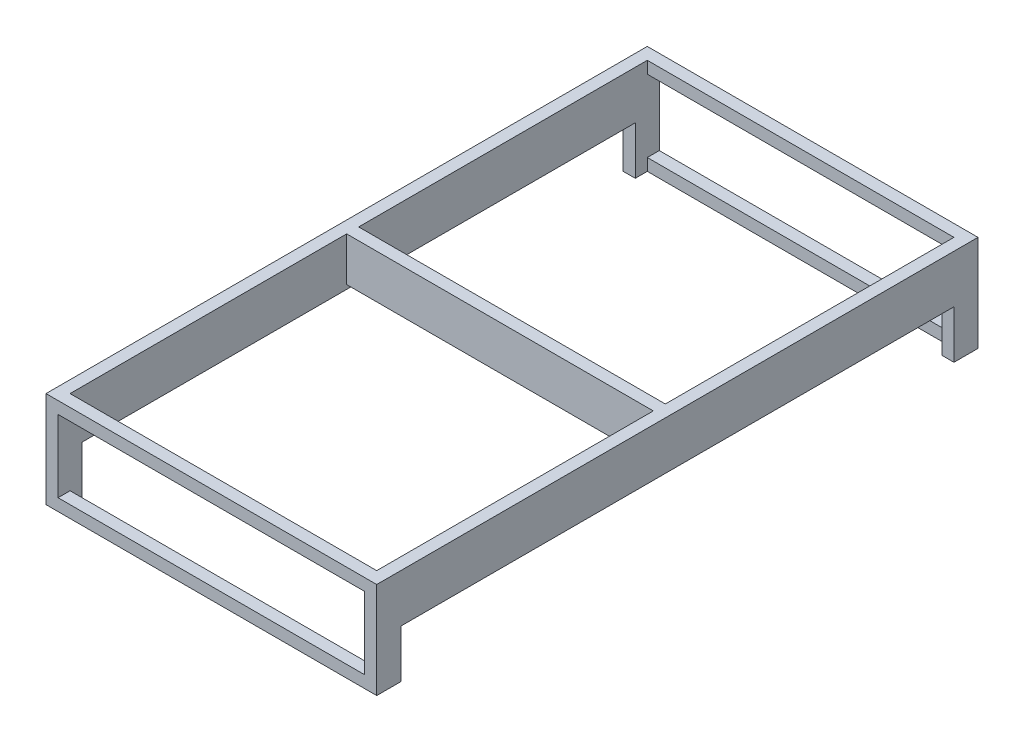
ISO-10303-21;
HEADER;
FILE_DESCRIPTION(('STEP AP214'),'2;1');
FILE_NAME('part.step','',(''),(''),'','','');
FILE_SCHEMA(('AUTOMOTIVE_DESIGN { 1 0 10303 214 1 1 1 1 }'));
ENDSEC;
DATA;
#1=APPLICATION_CONTEXT('core data for automotive mechanical design processes');
#2=APPLICATION_PROTOCOL_DEFINITION('international standard','automotive_design',2000,#1);
#3=PRODUCT_CONTEXT('',#1,'mechanical');
#4=PRODUCT('Part','Part','',(#3));
#5=PRODUCT_RELATED_PRODUCT_CATEGORY('part','',(#4));
#6=PRODUCT_DEFINITION_FORMATION('','',#4);
#7=PRODUCT_DEFINITION_CONTEXT('part definition',#1,'design');
#8=PRODUCT_DEFINITION('design','',#6,#7);
#9=PRODUCT_DEFINITION_SHAPE('','',#8);
#10=(LENGTH_UNIT() NAMED_UNIT(*) SI_UNIT(.MILLI.,.METRE.));
#11=(NAMED_UNIT(*) PLANE_ANGLE_UNIT() SI_UNIT($,.RADIAN.));
#12=(NAMED_UNIT(*) SI_UNIT($,.STERADIAN.) SOLID_ANGLE_UNIT());
#13=UNCERTAINTY_MEASURE_WITH_UNIT(LENGTH_MEASURE(1.E-05),#10,'distance_accuracy_value','');
#14=(GEOMETRIC_REPRESENTATION_CONTEXT(3) GLOBAL_UNCERTAINTY_ASSIGNED_CONTEXT((#13)) GLOBAL_UNIT_ASSIGNED_CONTEXT((#10,
#11,#12)) REPRESENTATION_CONTEXT('',''));
#15=CARTESIAN_POINT('',(0.,0.,0.));
#16=DIRECTION('',(0.,0.,1.));
#17=DIRECTION('',(1.,0.,0.));
#18=AXIS2_PLACEMENT_3D('',#15,#16,#17);
#19=CARTESIAN_POINT('',(0.,120.,1000.));
#20=DIRECTION('',(0.,-1.,0.));
#21=DIRECTION('',(0.,0.,-1.));
#22=AXIS2_PLACEMENT_3D('',#19,#20,#21);
#23=PLANE('',#22);
#24=DIRECTION('',(-1.,0.,0.));
#25=VECTOR('',#24,1.);
#26=CARTESIAN_POINT('',(0.,120.,980.));
#27=LINE('',#26,#25);
#28=CARTESIAN_POINT('',(510.,120.,980.));
#29=VERTEX_POINT('',#28);
#30=CARTESIAN_POINT('',(0.,120.,980.));
#31=VERTEX_POINT('',#30);
#32=EDGE_CURVE('E411',#29,#31,#27,.T.);
#33=ORIENTED_EDGE('',*,*,#32,.F.);
#34=DIRECTION('',(0.,0.,-1.));
#35=VECTOR('',#34,1.);
#36=CARTESIAN_POINT('',(510.,120.,1000.));
#37=LINE('',#36,#35);
#38=CARTESIAN_POINT('',(510.,120.,1000.));
#39=VERTEX_POINT('',#38);
#40=EDGE_CURVE('E358',#39,#29,#37,.T.);
#41=ORIENTED_EDGE('',*,*,#40,.F.);
#42=DIRECTION('',(-1.,0.,0.));
#43=VECTOR('',#42,1.);
#44=CARTESIAN_POINT('',(0.,120.,1000.));
#45=LINE('',#44,#43);
#46=CARTESIAN_POINT('',(0.,120.,1000.));
#47=VERTEX_POINT('',#46);
#48=EDGE_CURVE('E341',#39,#47,#45,.T.);
#49=ORIENTED_EDGE('',*,*,#48,.T.);
#50=DIRECTION('',(0.,0.,-1.));
#51=VECTOR('',#50,1.);
#52=CARTESIAN_POINT('',(0.,120.,1000.));
#53=LINE('',#52,#51);
#54=EDGE_CURVE('E354',#47,#31,#53,.T.);
#55=ORIENTED_EDGE('',*,*,#54,.T.);
#56=EDGE_LOOP('',(#33,#41,#49,#55));
#57=FACE_BOUND('',#56,.T.);
#58=ADVANCED_FACE('F37',(#57),#23,.T.);
#59=CARTESIAN_POINT('',(980.,60.,40.));
#60=DIRECTION('',(0.,0.,-1.));
#61=DIRECTION('',(0.,1.,0.));
#62=AXIS2_PLACEMENT_3D('',#59,#60,#61);
#63=PLANE('',#62);
#64=DIRECTION('',(-1.,0.,0.));
#65=VECTOR('',#64,1.);
#66=CARTESIAN_POINT('',(980.,-20.,40.));
#67=LINE('',#66,#65);
#68=CARTESIAN_POINT('',(0.,-20.,40.));
#69=VERTEX_POINT('',#68);
#70=CARTESIAN_POINT('',(-20.,-20.,40.));
#71=VERTEX_POINT('',#70);
#72=EDGE_CURVE('E303',#69,#71,#67,.T.);
#73=ORIENTED_EDGE('',*,*,#72,.F.);
#74=DIRECTION('',(0.,1.,0.));
#75=VECTOR('',#74,1.);
#76=CARTESIAN_POINT('',(0.,0.,40.));
#77=LINE('',#76,#75);
#78=CARTESIAN_POINT('',(0.,60.,40.));
#79=VERTEX_POINT('',#78);
#80=EDGE_CURVE('E327',#69,#79,#77,.T.);
#81=ORIENTED_EDGE('',*,*,#80,.T.);
#82=DIRECTION('',(-1.,0.,0.));
#83=VECTOR('',#82,1.);
#84=CARTESIAN_POINT('',(980.,60.,40.));
#85=LINE('',#84,#83);
#86=CARTESIAN_POINT('',(-20.,60.,40.));
#87=VERTEX_POINT('',#86);
#88=EDGE_CURVE('E304',#79,#87,#85,.T.);
#89=ORIENTED_EDGE('',*,*,#88,.T.);
#90=DIRECTION('',(0.,-1.,0.));
#91=VECTOR('',#90,1.);
#92=CARTESIAN_POINT('',(-20.,60.,40.));
#93=LINE('',#92,#91);
#94=EDGE_CURVE('E294',#87,#71,#93,.T.);
#95=ORIENTED_EDGE('',*,*,#94,.T.);
#96=EDGE_LOOP('',(#73,#81,#89,#95));
#97=FACE_BOUND('',#96,.T.);
#98=ADVANCED_FACE('F456',(#97),#63,.F.);
#99=CARTESIAN_POINT('',(980.,60.,960.));
#100=DIRECTION('',(0.,0.,1.));
#101=DIRECTION('',(1.,0.,0.));
#102=AXIS2_PLACEMENT_3D('',#99,#100,#101);
#103=PLANE('',#102);
#104=DIRECTION('',(0.,-1.,0.));
#105=VECTOR('',#104,1.);
#106=CARTESIAN_POINT('',(0.,0.,960.));
#107=LINE('',#106,#105);
#108=CARTESIAN_POINT('',(0.,60.,960.));
#109=VERTEX_POINT('',#108);
#110=CARTESIAN_POINT('',(0.,-20.,960.));
#111=VERTEX_POINT('',#110);
#112=EDGE_CURVE('E317',#109,#111,#107,.T.);
#113=ORIENTED_EDGE('',*,*,#112,.T.);
#114=DIRECTION('',(-1.,0.,0.));
#115=VECTOR('',#114,1.);
#116=CARTESIAN_POINT('',(980.,-20.,960.));
#117=LINE('',#116,#115);
#118=CARTESIAN_POINT('',(-20.,-20.,960.));
#119=VERTEX_POINT('',#118);
#120=EDGE_CURVE('E313',#111,#119,#117,.T.);
#121=ORIENTED_EDGE('',*,*,#120,.T.);
#122=DIRECTION('',(0.,1.,0.));
#123=VECTOR('',#122,1.);
#124=CARTESIAN_POINT('',(-20.,60.,960.));
#125=LINE('',#124,#123);
#126=CARTESIAN_POINT('',(-20.,60.,960.));
#127=VERTEX_POINT('',#126);
#128=EDGE_CURVE('E297',#119,#127,#125,.T.);
#129=ORIENTED_EDGE('',*,*,#128,.T.);
#130=DIRECTION('',(-1.,0.,0.));
#131=VECTOR('',#130,1.);
#132=CARTESIAN_POINT('',(980.,60.,960.));
#133=LINE('',#132,#131);
#134=EDGE_CURVE('E308',#109,#127,#133,.T.);
#135=ORIENTED_EDGE('',*,*,#134,.F.);
#136=EDGE_LOOP('',(#113,#121,#129,#135));
#137=FACE_BOUND('',#136,.T.);
#138=ADVANCED_FACE('F502',(#137),#103,.F.);
#139=CARTESIAN_POINT('',(-20.,-20.,1000.));
#140=DIRECTION('',(0.,1.,0.));
#141=DIRECTION('',(0.,0.,1.));
#142=AXIS2_PLACEMENT_3D('',#139,#140,#141);
#143=PLANE('',#142);
#144=DIRECTION('',(-1.,0.,0.));
#145=VECTOR('',#144,1.);
#146=CARTESIAN_POINT('',(-20.,-20.,20.));
#147=LINE('',#146,#145);
#148=CARTESIAN_POINT('',(510.,-20.,20.));
#149=VERTEX_POINT('',#148);
#150=CARTESIAN_POINT('',(0.,-20.,20.));
#151=VERTEX_POINT('',#150);
#152=EDGE_CURVE('E286',#149,#151,#147,.T.);
#153=ORIENTED_EDGE('',*,*,#152,.T.);
#154=DIRECTION('',(0.,0.,1.));
#155=VECTOR('',#154,1.);
#156=CARTESIAN_POINT('',(0.,-20.,1000.));
#157=LINE('',#156,#155);
#158=EDGE_CURVE('E281',#151,#69,#157,.T.);
#159=ORIENTED_EDGE('',*,*,#158,.T.);
#160=ORIENTED_EDGE('',*,*,#72,.T.);
#161=DIRECTION('',(0.,0.,-1.));
#162=VECTOR('',#161,1.);
#163=CARTESIAN_POINT('',(-20.,-20.,1000.));
#164=LINE('',#163,#162);
#165=CARTESIAN_POINT('',(-20.,-20.,0.));
#166=VERTEX_POINT('',#165);
#167=EDGE_CURVE('E380',#71,#166,#164,.T.);
#168=ORIENTED_EDGE('',*,*,#167,.T.);
#169=DIRECTION('',(1.,0.,0.));
#170=VECTOR('',#169,1.);
#171=CARTESIAN_POINT('',(-20.,-20.,0.));
#172=LINE('',#171,#170);
#173=CARTESIAN_POINT('',(530.,-20.,0.));
#174=VERTEX_POINT('',#173);
#175=EDGE_CURVE('E369',#166,#174,#172,.T.);
#176=ORIENTED_EDGE('',*,*,#175,.T.);
#177=DIRECTION('',(0.,0.,-1.));
#178=VECTOR('',#177,1.);
#179=CARTESIAN_POINT('',(530.,-20.,1000.));
#180=LINE('',#179,#178);
#181=CARTESIAN_POINT('',(530.,-20.,40.));
#182=VERTEX_POINT('',#181);
#183=EDGE_CURVE('E398',#182,#174,#180,.T.);
#184=ORIENTED_EDGE('',*,*,#183,.F.);
#185=CARTESIAN_POINT('',(510.,-20.,40.));
#186=VERTEX_POINT('',#185);
#187=EDGE_CURVE('E314',#182,#186,#67,.T.);
#188=ORIENTED_EDGE('',*,*,#187,.T.);
#189=DIRECTION('',(0.,0.,-1.));
#190=VECTOR('',#189,1.);
#191=CARTESIAN_POINT('',(510.,-20.,1000.));
#192=LINE('',#191,#190);
#193=EDGE_CURVE('E275',#186,#149,#192,.T.);
#194=ORIENTED_EDGE('',*,*,#193,.T.);
#195=EDGE_LOOP('',(#153,#159,#160,#168,#176,#184,#188,#194));
#196=FACE_BOUND('',#195,.T.);
#197=ADVANCED_FACE('F454',(#196),#143,.F.);
#198=CARTESIAN_POINT('',(0.,0.,1000.));
#199=DIRECTION('',(0.,1.,0.));
#200=DIRECTION('',(0.,0.,1.));
#201=AXIS2_PLACEMENT_3D('',#198,#199,#200);
#202=PLANE('',#201);
#203=DIRECTION('',(-1.,0.,0.));
#204=VECTOR('',#203,1.);
#205=CARTESIAN_POINT('',(0.,0.,20.));
#206=LINE('',#205,#204);
#207=CARTESIAN_POINT('',(510.,0.,20.));
#208=VERTEX_POINT('',#207);
#209=CARTESIAN_POINT('',(0.,0.,20.));
#210=VERTEX_POINT('',#209);
#211=EDGE_CURVE('E284',#208,#210,#206,.T.);
#212=ORIENTED_EDGE('',*,*,#211,.F.);
#213=DIRECTION('',(0.,0.,-1.));
#214=VECTOR('',#213,1.);
#215=CARTESIAN_POINT('',(510.,0.,1000.));
#216=LINE('',#215,#214);
#217=CARTESIAN_POINT('',(510.,0.,0.));
#218=VERTEX_POINT('',#217);
#219=EDGE_CURVE('E361',#208,#218,#216,.T.);
#220=ORIENTED_EDGE('',*,*,#219,.T.);
#221=DIRECTION('',(1.,0.,0.));
#222=VECTOR('',#221,1.);
#223=CARTESIAN_POINT('',(0.,0.,0.));
#224=LINE('',#223,#222);
#225=CARTESIAN_POINT('',(0.,0.,0.));
#226=VERTEX_POINT('',#225);
#227=EDGE_CURVE('E346',#226,#218,#224,.T.);
#228=ORIENTED_EDGE('',*,*,#227,.F.);
#229=DIRECTION('',(0.,0.,-1.));
#230=VECTOR('',#229,1.);
#231=CARTESIAN_POINT('',(0.,0.,1000.));
#232=LINE('',#231,#230);
#233=EDGE_CURVE('E365',#210,#226,#232,.T.);
#234=ORIENTED_EDGE('',*,*,#233,.F.);
#235=EDGE_LOOP('',(#212,#220,#228,#234));
#236=FACE_BOUND('',#235,.T.);
#237=ADVANCED_FACE('F446',(#236),#202,.T.);
#238=CARTESIAN_POINT('',(0.,0.,1000.));
#239=DIRECTION('',(0.,0.,1.));
#240=DIRECTION('',(1.,0.,0.));
#241=AXIS2_PLACEMENT_3D('',#238,#239,#240);
#242=PLANE('',#241);
#243=DIRECTION('',(1.,0.,0.));
#244=VECTOR('',#243,1.);
#245=CARTESIAN_POINT('',(-20.,-20.,1000.));
#246=LINE('',#245,#244);
#247=CARTESIAN_POINT('',(-20.,-20.,1000.));
#248=VERTEX_POINT('',#247);
#249=CARTESIAN_POINT('',(530.,-20.,1000.));
#250=VERTEX_POINT('',#249);
#251=EDGE_CURVE('E370',#248,#250,#246,.T.);
#252=ORIENTED_EDGE('',*,*,#251,.T.);
#253=DIRECTION('',(0.,1.,0.));
#254=VECTOR('',#253,1.);
#255=CARTESIAN_POINT('',(530.,-20.,1000.));
#256=LINE('',#255,#254);
#257=CARTESIAN_POINT('',(530.,140.,1000.));
#258=VERTEX_POINT('',#257);
#259=EDGE_CURVE('E373',#250,#258,#256,.T.);
#260=ORIENTED_EDGE('',*,*,#259,.T.);
#261=DIRECTION('',(-1.,0.,0.));
#262=VECTOR('',#261,1.);
#263=CARTESIAN_POINT('',(-20.,140.,1000.));
#264=LINE('',#263,#262);
#265=CARTESIAN_POINT('',(-20.,140.,1000.));
#266=VERTEX_POINT('',#265);
#267=EDGE_CURVE('E376',#258,#266,#264,.T.);
#268=ORIENTED_EDGE('',*,*,#267,.T.);
#269=DIRECTION('',(0.,-1.,0.));
#270=VECTOR('',#269,1.);
#271=CARTESIAN_POINT('',(-20.,-20.,1000.));
#272=LINE('',#271,#270);
#273=EDGE_CURVE('E378',#266,#248,#272,.T.);
#274=ORIENTED_EDGE('',*,*,#273,.T.);
#275=EDGE_LOOP('',(#252,#260,#268,#274));
#276=FACE_BOUND('',#275,.T.);
#277=DIRECTION('',(1.,0.,0.));
#278=VECTOR('',#277,1.);
#279=CARTESIAN_POINT('',(0.,0.,1000.));
#280=LINE('',#279,#278);
#281=CARTESIAN_POINT('',(0.,0.,1000.));
#282=VERTEX_POINT('',#281);
#283=CARTESIAN_POINT('',(510.,0.,1000.));
#284=VERTEX_POINT('',#283);
#285=EDGE_CURVE('E335',#282,#284,#280,.T.);
#286=ORIENTED_EDGE('',*,*,#285,.F.);
#287=DIRECTION('',(0.,-1.,0.));
#288=VECTOR('',#287,1.);
#289=CARTESIAN_POINT('',(0.,0.,1000.));
#290=LINE('',#289,#288);
#291=EDGE_CURVE('E333',#47,#282,#290,.T.);
#292=ORIENTED_EDGE('',*,*,#291,.F.);
#293=ORIENTED_EDGE('',*,*,#48,.F.);
#294=DIRECTION('',(0.,1.,0.));
#295=VECTOR('',#294,1.);
#296=CARTESIAN_POINT('',(510.,0.,1000.));
#297=LINE('',#296,#295);
#298=EDGE_CURVE('E338',#284,#39,#297,.T.);
#299=ORIENTED_EDGE('',*,*,#298,.F.);
#300=EDGE_LOOP('',(#286,#292,#293,#299));
#301=FACE_BOUND('',#300,.T.);
#302=ADVANCED_FACE('F495',(#276,#301),#242,.T.);
#303=CARTESIAN_POINT('',(0.,0.,0.));
#304=DIRECTION('',(0.,0.,1.));
#305=DIRECTION('',(1.,0.,0.));
#306=AXIS2_PLACEMENT_3D('',#303,#304,#305);
#307=PLANE('',#306);
#308=ORIENTED_EDGE('',*,*,#175,.F.);
#309=DIRECTION('',(0.,-1.,0.));
#310=VECTOR('',#309,1.);
#311=CARTESIAN_POINT('',(-20.,-20.,0.));
#312=LINE('',#311,#310);
#313=CARTESIAN_POINT('',(-20.,140.,0.));
#314=VERTEX_POINT('',#313);
#315=EDGE_CURVE('E374',#314,#166,#312,.T.);
#316=ORIENTED_EDGE('',*,*,#315,.F.);
#317=DIRECTION('',(-1.,0.,0.));
#318=VECTOR('',#317,1.);
#319=CARTESIAN_POINT('',(-20.,140.,0.));
#320=LINE('',#319,#318);
#321=CARTESIAN_POINT('',(530.,140.,0.));
#322=VERTEX_POINT('',#321);
#323=EDGE_CURVE('E386',#322,#314,#320,.T.);
#324=ORIENTED_EDGE('',*,*,#323,.F.);
#325=DIRECTION('',(0.,1.,0.));
#326=VECTOR('',#325,1.);
#327=CARTESIAN_POINT('',(530.,-20.,0.));
#328=LINE('',#327,#326);
#329=EDGE_CURVE('E383',#174,#322,#328,.T.);
#330=ORIENTED_EDGE('',*,*,#329,.F.);
#331=EDGE_LOOP('',(#308,#316,#324,#330));
#332=FACE_BOUND('',#331,.T.);
#333=DIRECTION('',(0.,-1.,0.));
#334=VECTOR('',#333,1.);
#335=CARTESIAN_POINT('',(0.,0.,0.));
#336=LINE('',#335,#334);
#337=CARTESIAN_POINT('',(0.,120.,0.));
#338=VERTEX_POINT('',#337);
#339=EDGE_CURVE('E332',#338,#226,#336,.T.);
#340=ORIENTED_EDGE('',*,*,#339,.T.);
#341=ORIENTED_EDGE('',*,*,#227,.T.);
#342=DIRECTION('',(0.,1.,0.));
#343=VECTOR('',#342,1.);
#344=CARTESIAN_POINT('',(510.,0.,0.));
#345=LINE('',#344,#343);
#346=CARTESIAN_POINT('',(510.,120.,0.));
#347=VERTEX_POINT('',#346);
#348=EDGE_CURVE('E349',#218,#347,#345,.T.);
#349=ORIENTED_EDGE('',*,*,#348,.T.);
#350=DIRECTION('',(-1.,0.,0.));
#351=VECTOR('',#350,1.);
#352=CARTESIAN_POINT('',(0.,120.,0.));
#353=LINE('',#352,#351);
#354=EDGE_CURVE('E336',#347,#338,#353,.T.);
#355=ORIENTED_EDGE('',*,*,#354,.T.);
#356=EDGE_LOOP('',(#340,#341,#349,#355));
#357=FACE_BOUND('',#356,.T.);
#358=ADVANCED_FACE('F442',(#332,#357),#307,.F.);
#359=ORIENTED_EDGE('',*,*,#120,.F.);
#360=DIRECTION('',(0.,0.,1.));
#361=VECTOR('',#360,1.);
#362=CARTESIAN_POINT('',(0.,-20.,1000.));
#363=LINE('',#362,#361);
#364=CARTESIAN_POINT('',(0.,-20.,980.));
#365=VERTEX_POINT('',#364);
#366=EDGE_CURVE('E278',#111,#365,#363,.T.);
#367=ORIENTED_EDGE('',*,*,#366,.T.);
#368=DIRECTION('',(1.,0.,0.));
#369=VECTOR('',#368,1.);
#370=CARTESIAN_POINT('',(-20.,-20.,980.));
#371=LINE('',#370,#369);
#372=CARTESIAN_POINT('',(510.,-20.,980.));
#373=VERTEX_POINT('',#372);
#374=EDGE_CURVE('E291',#365,#373,#371,.T.);
#375=ORIENTED_EDGE('',*,*,#374,.T.);
#376=DIRECTION('',(0.,0.,-1.));
#377=VECTOR('',#376,1.);
#378=CARTESIAN_POINT('',(510.,-20.,1000.));
#379=LINE('',#378,#377);
#380=CARTESIAN_POINT('',(510.,-20.,960.));
#381=VERTEX_POINT('',#380);
#382=EDGE_CURVE('E272',#373,#381,#379,.T.);
#383=ORIENTED_EDGE('',*,*,#382,.T.);
#384=CARTESIAN_POINT('',(530.,-20.,960.));
#385=VERTEX_POINT('',#384);
#386=EDGE_CURVE('E310',#385,#381,#117,.T.);
#387=ORIENTED_EDGE('',*,*,#386,.F.);
#388=EDGE_CURVE('E399',#250,#385,#180,.T.);
#389=ORIENTED_EDGE('',*,*,#388,.F.);
#390=ORIENTED_EDGE('',*,*,#251,.F.);
#391=EDGE_CURVE('E391',#248,#119,#164,.T.);
#392=ORIENTED_EDGE('',*,*,#391,.T.);
#393=EDGE_LOOP('',(#359,#367,#375,#383,#387,#389,#390,#392));
#394=FACE_BOUND('',#393,.T.);
#395=ADVANCED_FACE('F39',(#394),#143,.F.);
#396=CARTESIAN_POINT('',(530.,-20.,1000.));
#397=DIRECTION('',(-1.,0.,0.));
#398=DIRECTION('',(0.,0.,1.));
#399=AXIS2_PLACEMENT_3D('',#396,#397,#398);
#400=PLANE('',#399);
#401=ORIENTED_EDGE('',*,*,#329,.T.);
#402=DIRECTION('',(0.,0.,-1.));
#403=VECTOR('',#402,1.);
#404=CARTESIAN_POINT('',(530.,140.,1000.));
#405=LINE('',#404,#403);
#406=EDGE_CURVE('E396',#258,#322,#405,.T.);
#407=ORIENTED_EDGE('',*,*,#406,.F.);
#408=ORIENTED_EDGE('',*,*,#259,.F.);
#409=ORIENTED_EDGE('',*,*,#388,.T.);
#410=DIRECTION('',(0.,1.,0.));
#411=VECTOR('',#410,1.);
#412=CARTESIAN_POINT('',(530.,-20.,960.));
#413=LINE('',#412,#411);
#414=CARTESIAN_POINT('',(530.,60.,960.));
#415=VERTEX_POINT('',#414);
#416=EDGE_CURVE('E319',#385,#415,#413,.T.);
#417=ORIENTED_EDGE('',*,*,#416,.T.);
#418=DIRECTION('',(0.,0.,-1.));
#419=VECTOR('',#418,1.);
#420=CARTESIAN_POINT('',(530.,60.,1000.));
#421=LINE('',#420,#419);
#422=CARTESIAN_POINT('',(530.,60.,40.));
#423=VERTEX_POINT('',#422);
#424=EDGE_CURVE('E324',#415,#423,#421,.T.);
#425=ORIENTED_EDGE('',*,*,#424,.T.);
#426=DIRECTION('',(0.,-1.,0.));
#427=VECTOR('',#426,1.);
#428=CARTESIAN_POINT('',(530.,-20.0000000000001,40.));
#429=LINE('',#428,#427);
#430=EDGE_CURVE('E329',#423,#182,#429,.T.);
#431=ORIENTED_EDGE('',*,*,#430,.T.);
#432=ORIENTED_EDGE('',*,*,#183,.T.);
#433=EDGE_LOOP('',(#401,#407,#408,#409,#417,#425,#431,#432));
#434=FACE_BOUND('',#433,.T.);
#435=ADVANCED_FACE('F471',(#434),#400,.F.);
#436=CARTESIAN_POINT('',(-20.,140.,1000.));
#437=DIRECTION('',(0.,-1.,0.));
#438=DIRECTION('',(0.,0.,-1.));
#439=AXIS2_PLACEMENT_3D('',#436,#437,#438);
#440=PLANE('',#439);
#441=DIRECTION('',(-1.,0.,0.));
#442=VECTOR('',#441,1.);
#443=CARTESIAN_POINT('',(-20.,140.,500.));
#444=LINE('',#443,#442);
#445=CARTESIAN_POINT('',(510.,140.,500.));
#446=VERTEX_POINT('',#445);
#447=CARTESIAN_POINT('',(0.,140.,500.));
#448=VERTEX_POINT('',#447);
#449=EDGE_CURVE('E241',#446,#448,#444,.T.);
#450=ORIENTED_EDGE('',*,*,#449,.T.);
#451=DIRECTION('',(0.,0.,1.));
#452=VECTOR('',#451,1.);
#453=CARTESIAN_POINT('',(0.,140.,0.));
#454=LINE('',#453,#452);
#455=CARTESIAN_POINT('',(0.,140.,20.));
#456=VERTEX_POINT('',#455);
#457=EDGE_CURVE('E230',#456,#448,#454,.T.);
#458=ORIENTED_EDGE('',*,*,#457,.F.);
#459=DIRECTION('',(-1.,0.,0.));
#460=VECTOR('',#459,1.);
#461=CARTESIAN_POINT('',(0.,140.,20.));
#462=LINE('',#461,#460);
#463=CARTESIAN_POINT('',(510.,140.,20.));
#464=VERTEX_POINT('',#463);
#465=EDGE_CURVE('E231',#464,#456,#462,.T.);
#466=ORIENTED_EDGE('',*,*,#465,.F.);
#467=DIRECTION('',(0.,0.,-1.));
#468=VECTOR('',#467,1.);
#469=CARTESIAN_POINT('',(510.,140.,0.));
#470=LINE('',#469,#468);
#471=EDGE_CURVE('E253',#446,#464,#470,.T.);
#472=ORIENTED_EDGE('',*,*,#471,.F.);
#473=EDGE_LOOP('',(#450,#458,#466,#472));
#474=FACE_BOUND('',#473,.T.);
#475=DIRECTION('',(1.,0.,0.));
#476=VECTOR('',#475,1.);
#477=CARTESIAN_POINT('',(-20.,140.,520.));
#478=LINE('',#477,#476);
#479=CARTESIAN_POINT('',(0.,140.,520.));
#480=VERTEX_POINT('',#479);
#481=CARTESIAN_POINT('',(510.,140.,520.));
#482=VERTEX_POINT('',#481);
#483=EDGE_CURVE('E226',#480,#482,#478,.T.);
#484=ORIENTED_EDGE('',*,*,#483,.T.);
#485=CARTESIAN_POINT('',(510.,140.,980.));
#486=VERTEX_POINT('',#485);
#487=EDGE_CURVE('E254',#486,#482,#470,.T.);
#488=ORIENTED_EDGE('',*,*,#487,.F.);
#489=DIRECTION('',(1.,0.,0.));
#490=VECTOR('',#489,1.);
#491=CARTESIAN_POINT('',(0.,140.,980.));
#492=LINE('',#491,#490);
#493=CARTESIAN_POINT('',(0.,140.,980.));
#494=VERTEX_POINT('',#493);
#495=EDGE_CURVE('E227',#494,#486,#492,.T.);
#496=ORIENTED_EDGE('',*,*,#495,.F.);
#497=EDGE_CURVE('E221',#480,#494,#454,.T.);
#498=ORIENTED_EDGE('',*,*,#497,.F.);
#499=EDGE_LOOP('',(#484,#488,#496,#498));
#500=FACE_BOUND('',#499,.T.);
#501=ORIENTED_EDGE('',*,*,#406,.T.);
#502=ORIENTED_EDGE('',*,*,#323,.T.);
#503=DIRECTION('',(0.,0.,-1.));
#504=VECTOR('',#503,1.);
#505=CARTESIAN_POINT('',(-20.,140.,1000.));
#506=LINE('',#505,#504);
#507=EDGE_CURVE('E394',#266,#314,#506,.T.);
#508=ORIENTED_EDGE('',*,*,#507,.F.);
#509=ORIENTED_EDGE('',*,*,#267,.F.);
#510=EDGE_LOOP('',(#501,#502,#508,#509));
#511=FACE_BOUND('',#510,.T.);
#512=ADVANCED_FACE('F222',(#474,#500,#511),#440,.F.);
#513=CARTESIAN_POINT('',(-20.,-20.,1000.));
#514=DIRECTION('',(1.,0.,0.));
#515=DIRECTION('',(0.,0.,-1.));
#516=AXIS2_PLACEMENT_3D('',#513,#514,#515);
#517=PLANE('',#516);
#518=ORIENTED_EDGE('',*,*,#507,.T.);
#519=ORIENTED_EDGE('',*,*,#315,.T.);
#520=ORIENTED_EDGE('',*,*,#167,.F.);
#521=ORIENTED_EDGE('',*,*,#94,.F.);
#522=DIRECTION('',(0.,0.,-1.));
#523=VECTOR('',#522,1.);
#524=CARTESIAN_POINT('',(-20.,60.,40.));
#525=LINE('',#524,#523);
#526=EDGE_CURVE('E300',#127,#87,#525,.T.);
#527=ORIENTED_EDGE('',*,*,#526,.F.);
#528=ORIENTED_EDGE('',*,*,#128,.F.);
#529=ORIENTED_EDGE('',*,*,#391,.F.);
#530=ORIENTED_EDGE('',*,*,#273,.F.);
#531=EDGE_LOOP('',(#518,#519,#520,#521,#527,#528,#529,#530));
#532=FACE_BOUND('',#531,.T.);
#533=ADVANCED_FACE('F462',(#532),#517,.F.);
#534=CARTESIAN_POINT('',(0.,0.,1000.));
#535=DIRECTION('',(1.,0.,0.));
#536=DIRECTION('',(0.,0.,-1.));
#537=AXIS2_PLACEMENT_3D('',#534,#535,#536);
#538=PLANE('',#537);
#539=DIRECTION('',(0.,1.,0.));
#540=VECTOR('',#539,1.);
#541=CARTESIAN_POINT('',(0.,0.,500.));
#542=LINE('',#541,#540);
#543=CARTESIAN_POINT('',(0.,67.,500.));
#544=VERTEX_POINT('',#543);
#545=EDGE_CURVE('E52',#544,#448,#542,.T.);
#546=ORIENTED_EDGE('',*,*,#545,.F.);
#547=DIRECTION('',(0.,0.,-1.));
#548=VECTOR('',#547,1.);
#549=CARTESIAN_POINT('',(0.,67.,1000.));
#550=LINE('',#549,#548);
#551=CARTESIAN_POINT('',(0.,67.,520.));
#552=VERTEX_POINT('',#551);
#553=EDGE_CURVE('E56',#552,#544,#550,.T.);
#554=ORIENTED_EDGE('',*,*,#553,.F.);
#555=DIRECTION('',(0.,-1.,0.));
#556=VECTOR('',#555,1.);
#557=CARTESIAN_POINT('',(0.,0.,520.));
#558=LINE('',#557,#556);
#559=EDGE_CURVE('E233',#480,#552,#558,.T.);
#560=ORIENTED_EDGE('',*,*,#559,.F.);
#561=ORIENTED_EDGE('',*,*,#497,.T.);
#562=DIRECTION('',(0.,1.,0.));
#563=VECTOR('',#562,1.);
#564=CARTESIAN_POINT('',(0.,-860.,980.));
#565=LINE('',#564,#563);
#566=EDGE_CURVE('E259',#31,#494,#565,.T.);
#567=ORIENTED_EDGE('',*,*,#566,.F.);
#568=ORIENTED_EDGE('',*,*,#54,.F.);
#569=ORIENTED_EDGE('',*,*,#291,.T.);
#570=CARTESIAN_POINT('',(0.,0.,980.));
#571=VERTEX_POINT('',#570);
#572=EDGE_CURVE('E366',#282,#571,#232,.T.);
#573=ORIENTED_EDGE('',*,*,#572,.T.);
#574=EDGE_CURVE('E261',#365,#571,#565,.T.);
#575=ORIENTED_EDGE('',*,*,#574,.F.);
#576=ORIENTED_EDGE('',*,*,#366,.F.);
#577=ORIENTED_EDGE('',*,*,#112,.F.);
#578=DIRECTION('',(0.,0.,1.));
#579=VECTOR('',#578,1.);
#580=CARTESIAN_POINT('',(0.,60.,1000.));
#581=LINE('',#580,#579);
#582=EDGE_CURVE('E322',#79,#109,#581,.T.);
#583=ORIENTED_EDGE('',*,*,#582,.F.);
#584=ORIENTED_EDGE('',*,*,#80,.F.);
#585=ORIENTED_EDGE('',*,*,#158,.F.);
#586=DIRECTION('',(0.,1.,0.));
#587=VECTOR('',#586,1.);
#588=CARTESIAN_POINT('',(0.,-860.,20.));
#589=LINE('',#588,#587);
#590=EDGE_CURVE('E262',#151,#210,#589,.T.);
#591=ORIENTED_EDGE('',*,*,#590,.T.);
#592=ORIENTED_EDGE('',*,*,#233,.T.);
#593=ORIENTED_EDGE('',*,*,#339,.F.);
#594=CARTESIAN_POINT('',(0.,120.,20.));
#595=VERTEX_POINT('',#594);
#596=EDGE_CURVE('E343',#595,#338,#53,.T.);
#597=ORIENTED_EDGE('',*,*,#596,.F.);
#598=EDGE_CURVE('E263',#595,#456,#589,.T.);
#599=ORIENTED_EDGE('',*,*,#598,.T.);
#600=ORIENTED_EDGE('',*,*,#457,.T.);
#601=EDGE_LOOP('',(#546,#554,#560,#561,#567,#568,#569,#573,#575,#576,#577,#583,#584,#585,#591,
#592,#593,#597,#599,#600));
#602=FACE_BOUND('',#601,.T.);
#603=ADVANCED_FACE('F234',(#602),#538,.T.);
#604=DIRECTION('',(1.,0.,0.));
#605=VECTOR('',#604,1.);
#606=CARTESIAN_POINT('',(0.,0.,980.));
#607=LINE('',#606,#605);
#608=CARTESIAN_POINT('',(510.,0.,980.));
#609=VERTEX_POINT('',#608);
#610=EDGE_CURVE('E289',#571,#609,#607,.T.);
#611=ORIENTED_EDGE('',*,*,#610,.F.);
#612=ORIENTED_EDGE('',*,*,#572,.F.);
#613=ORIENTED_EDGE('',*,*,#285,.T.);
#614=EDGE_CURVE('E362',#284,#609,#216,.T.);
#615=ORIENTED_EDGE('',*,*,#614,.T.);
#616=EDGE_LOOP('',(#611,#612,#613,#615));
#617=FACE_BOUND('',#616,.T.);
#618=ADVANCED_FACE('F511',(#617),#202,.T.);
#619=CARTESIAN_POINT('',(510.,0.,1000.));
#620=DIRECTION('',(-1.,0.,0.));
#621=DIRECTION('',(0.,0.,1.));
#622=AXIS2_PLACEMENT_3D('',#619,#620,#621);
#623=PLANE('',#622);
#624=DIRECTION('',(0.,-1.,0.));
#625=VECTOR('',#624,1.);
#626=CARTESIAN_POINT('',(510.,0.,500.));
#627=LINE('',#626,#625);
#628=CARTESIAN_POINT('',(510.,67.,500.));
#629=VERTEX_POINT('',#628);
#630=EDGE_CURVE('E11',#446,#629,#627,.T.);
#631=ORIENTED_EDGE('',*,*,#630,.F.);
#632=ORIENTED_EDGE('',*,*,#471,.T.);
#633=DIRECTION('',(0.,1.,0.));
#634=VECTOR('',#633,1.);
#635=CARTESIAN_POINT('',(510.,-860.,20.));
#636=LINE('',#635,#634);
#637=CARTESIAN_POINT('',(510.,120.,20.));
#638=VERTEX_POINT('',#637);
#639=EDGE_CURVE('E266',#638,#464,#636,.T.);
#640=ORIENTED_EDGE('',*,*,#639,.F.);
#641=EDGE_CURVE('E357',#638,#347,#37,.T.);
#642=ORIENTED_EDGE('',*,*,#641,.T.);
#643=ORIENTED_EDGE('',*,*,#348,.F.);
#644=ORIENTED_EDGE('',*,*,#219,.F.);
#645=EDGE_CURVE('E265',#149,#208,#636,.T.);
#646=ORIENTED_EDGE('',*,*,#645,.F.);
#647=ORIENTED_EDGE('',*,*,#193,.F.);
#648=DIRECTION('',(0.,-1.,0.));
#649=VECTOR('',#648,1.);
#650=CARTESIAN_POINT('',(510.,0.,40.));
#651=LINE('',#650,#649);
#652=CARTESIAN_POINT('',(510.,60.,40.));
#653=VERTEX_POINT('',#652);
#654=EDGE_CURVE('E406',#653,#186,#651,.T.);
#655=ORIENTED_EDGE('',*,*,#654,.F.);
#656=DIRECTION('',(0.,0.,-1.));
#657=VECTOR('',#656,1.);
#658=CARTESIAN_POINT('',(510.,60.,1000.));
#659=LINE('',#658,#657);
#660=CARTESIAN_POINT('',(510.,60.,960.));
#661=VERTEX_POINT('',#660);
#662=EDGE_CURVE('E404',#661,#653,#659,.T.);
#663=ORIENTED_EDGE('',*,*,#662,.F.);
#664=DIRECTION('',(0.,1.,0.));
#665=VECTOR('',#664,1.);
#666=CARTESIAN_POINT('',(510.,0.,960.));
#667=LINE('',#666,#665);
#668=EDGE_CURVE('E402',#381,#661,#667,.T.);
#669=ORIENTED_EDGE('',*,*,#668,.F.);
#670=ORIENTED_EDGE('',*,*,#382,.F.);
#671=DIRECTION('',(0.,1.,0.));
#672=VECTOR('',#671,1.);
#673=CARTESIAN_POINT('',(510.,-860.,980.));
#674=LINE('',#673,#672);
#675=EDGE_CURVE('E269',#373,#609,#674,.T.);
#676=ORIENTED_EDGE('',*,*,#675,.T.);
#677=ORIENTED_EDGE('',*,*,#614,.F.);
#678=ORIENTED_EDGE('',*,*,#298,.T.);
#679=ORIENTED_EDGE('',*,*,#40,.T.);
#680=EDGE_CURVE('E258',#29,#486,#674,.T.);
#681=ORIENTED_EDGE('',*,*,#680,.T.);
#682=ORIENTED_EDGE('',*,*,#487,.T.);
#683=DIRECTION('',(0.,1.,0.));
#684=VECTOR('',#683,1.);
#685=CARTESIAN_POINT('',(510.,0.,520.));
#686=LINE('',#685,#684);
#687=CARTESIAN_POINT('',(510.,67.,520.));
#688=VERTEX_POINT('',#687);
#689=EDGE_CURVE('E45',#688,#482,#686,.T.);
#690=ORIENTED_EDGE('',*,*,#689,.F.);
#691=DIRECTION('',(0.,0.,1.));
#692=VECTOR('',#691,1.);
#693=CARTESIAN_POINT('',(510.,67.,1000.));
#694=LINE('',#693,#692);
#695=EDGE_CURVE('E413',#629,#688,#694,.T.);
#696=ORIENTED_EDGE('',*,*,#695,.F.);
#697=EDGE_LOOP('',(#631,#632,#640,#642,#643,#644,#646,#647,#655,#663,#669,#670,#676,#677,#678,
#679,#681,#682,#690,#696));
#698=FACE_BOUND('',#697,.T.);
#699=ADVANCED_FACE('F424',(#698),#623,.T.);
#700=DIRECTION('',(1.,0.,0.));
#701=VECTOR('',#700,1.);
#702=CARTESIAN_POINT('',(0.,120.,20.));
#703=LINE('',#702,#701);
#704=EDGE_CURVE('E408',#595,#638,#703,.T.);
#705=ORIENTED_EDGE('',*,*,#704,.F.);
#706=ORIENTED_EDGE('',*,*,#596,.T.);
#707=ORIENTED_EDGE('',*,*,#354,.F.);
#708=ORIENTED_EDGE('',*,*,#641,.F.);
#709=EDGE_LOOP('',(#705,#706,#707,#708));
#710=FACE_BOUND('',#709,.T.);
#711=ADVANCED_FACE('F435',(#710),#23,.T.);
#712=ORIENTED_EDGE('',*,*,#654,.T.);
#713=ORIENTED_EDGE('',*,*,#187,.F.);
#714=ORIENTED_EDGE('',*,*,#430,.F.);
#715=EDGE_CURVE('E306',#423,#653,#85,.T.);
#716=ORIENTED_EDGE('',*,*,#715,.T.);
#717=EDGE_LOOP('',(#712,#713,#714,#716));
#718=FACE_BOUND('',#717,.T.);
#719=ADVANCED_FACE('F476',(#718),#63,.F.);
#720=CARTESIAN_POINT('',(980.,60.,40.));
#721=DIRECTION('',(0.,1.,0.));
#722=DIRECTION('',(0.,0.,1.));
#723=AXIS2_PLACEMENT_3D('',#720,#721,#722);
#724=PLANE('',#723);
#725=EDGE_CURVE('E307',#415,#661,#133,.T.);
#726=ORIENTED_EDGE('',*,*,#725,.T.);
#727=ORIENTED_EDGE('',*,*,#662,.T.);
#728=ORIENTED_EDGE('',*,*,#715,.F.);
#729=ORIENTED_EDGE('',*,*,#424,.F.);
#730=EDGE_LOOP('',(#726,#727,#728,#729));
#731=FACE_BOUND('',#730,.T.);
#732=ADVANCED_FACE('F480',(#731),#724,.F.);
#733=ORIENTED_EDGE('',*,*,#582,.T.);
#734=ORIENTED_EDGE('',*,*,#134,.T.);
#735=ORIENTED_EDGE('',*,*,#526,.T.);
#736=ORIENTED_EDGE('',*,*,#88,.F.);
#737=EDGE_LOOP('',(#733,#734,#735,#736));
#738=FACE_BOUND('',#737,.T.);
#739=ADVANCED_FACE('F572',(#738),#724,.F.);
#740=ORIENTED_EDGE('',*,*,#386,.T.);
#741=ORIENTED_EDGE('',*,*,#668,.T.);
#742=ORIENTED_EDGE('',*,*,#725,.F.);
#743=ORIENTED_EDGE('',*,*,#416,.F.);
#744=EDGE_LOOP('',(#740,#741,#742,#743));
#745=FACE_BOUND('',#744,.T.);
#746=ADVANCED_FACE('F491',(#745),#103,.F.);
#747=CARTESIAN_POINT('',(0.,-860.,980.));
#748=DIRECTION('',(0.,0.,1.));
#749=DIRECTION('',(1.,0.,0.));
#750=AXIS2_PLACEMENT_3D('',#747,#748,#749);
#751=PLANE('',#750);
#752=ORIENTED_EDGE('',*,*,#574,.T.);
#753=ORIENTED_EDGE('',*,*,#610,.T.);
#754=ORIENTED_EDGE('',*,*,#675,.F.);
#755=ORIENTED_EDGE('',*,*,#374,.F.);
#756=EDGE_LOOP('',(#752,#753,#754,#755));
#757=FACE_BOUND('',#756,.T.);
#758=ADVANCED_FACE('F509',(#757),#751,.F.);
#759=CARTESIAN_POINT('',(0.,-860.,20.));
#760=DIRECTION('',(0.,0.,-1.));
#761=DIRECTION('',(-1.,0.,0.));
#762=AXIS2_PLACEMENT_3D('',#759,#760,#761);
#763=PLANE('',#762);
#764=ORIENTED_EDGE('',*,*,#645,.T.);
#765=ORIENTED_EDGE('',*,*,#211,.T.);
#766=ORIENTED_EDGE('',*,*,#590,.F.);
#767=ORIENTED_EDGE('',*,*,#152,.F.);
#768=EDGE_LOOP('',(#764,#765,#766,#767));
#769=FACE_BOUND('',#768,.T.);
#770=ADVANCED_FACE('F450',(#769),#763,.F.);
#771=ORIENTED_EDGE('',*,*,#32,.T.);
#772=ORIENTED_EDGE('',*,*,#566,.T.);
#773=ORIENTED_EDGE('',*,*,#495,.T.);
#774=ORIENTED_EDGE('',*,*,#680,.F.);
#775=EDGE_LOOP('',(#771,#772,#773,#774));
#776=FACE_BOUND('',#775,.T.);
#777=ADVANCED_FACE('F521',(#776),#751,.F.);
#778=ORIENTED_EDGE('',*,*,#704,.T.);
#779=ORIENTED_EDGE('',*,*,#639,.T.);
#780=ORIENTED_EDGE('',*,*,#465,.T.);
#781=ORIENTED_EDGE('',*,*,#598,.F.);
#782=EDGE_LOOP('',(#778,#779,#780,#781));
#783=FACE_BOUND('',#782,.T.);
#784=ADVANCED_FACE('F428',(#783),#763,.F.);
#785=CARTESIAN_POINT('',(-20.,67.,500.));
#786=DIRECTION('',(0.,0.,-1.));
#787=DIRECTION('',(-1.,0.,0.));
#788=AXIS2_PLACEMENT_3D('',#785,#786,#787);
#789=PLANE('',#788);
#790=DIRECTION('',(-1.,0.,0.));
#791=VECTOR('',#790,1.);
#792=CARTESIAN_POINT('',(-20.,67.,500.));
#793=LINE('',#792,#791);
#794=EDGE_CURVE('E247',#629,#544,#793,.T.);
#795=ORIENTED_EDGE('',*,*,#794,.T.);
#796=ORIENTED_EDGE('',*,*,#545,.T.);
#797=ORIENTED_EDGE('',*,*,#449,.F.);
#798=ORIENTED_EDGE('',*,*,#630,.T.);
#799=EDGE_LOOP('',(#795,#796,#797,#798));
#800=FACE_BOUND('',#799,.T.);
#801=ADVANCED_FACE('F422',(#800),#789,.T.);
#802=CARTESIAN_POINT('',(-20.,67.,520.));
#803=DIRECTION('',(0.,0.,1.));
#804=DIRECTION('',(1.,0.,0.));
#805=AXIS2_PLACEMENT_3D('',#802,#803,#804);
#806=PLANE('',#805);
#807=ORIENTED_EDGE('',*,*,#483,.F.);
#808=ORIENTED_EDGE('',*,*,#559,.T.);
#809=DIRECTION('',(1.,0.,0.));
#810=VECTOR('',#809,1.);
#811=CARTESIAN_POINT('',(-20.,67.,520.));
#812=LINE('',#811,#810);
#813=EDGE_CURVE('E244',#552,#688,#812,.T.);
#814=ORIENTED_EDGE('',*,*,#813,.T.);
#815=ORIENTED_EDGE('',*,*,#689,.T.);
#816=EDGE_LOOP('',(#807,#808,#814,#815));
#817=FACE_BOUND('',#816,.T.);
#818=ADVANCED_FACE('F240',(#817),#806,.T.);
#819=CARTESIAN_POINT('',(0.,67.,0.));
#820=DIRECTION('',(0.,-1.,0.));
#821=DIRECTION('',(0.,0.,-1.));
#822=AXIS2_PLACEMENT_3D('',#819,#820,#821);
#823=PLANE('',#822);
#824=ORIENTED_EDGE('',*,*,#813,.F.);
#825=ORIENTED_EDGE('',*,*,#553,.T.);
#826=ORIENTED_EDGE('',*,*,#794,.F.);
#827=ORIENTED_EDGE('',*,*,#695,.T.);
#828=EDGE_LOOP('',(#824,#825,#826,#827));
#829=FACE_BOUND('',#828,.T.);
#830=ADVANCED_FACE('F417',(#829),#823,.T.);
#831=CLOSED_SHELL('',(#58,#98,#138,#197,#237,#302,#358,#395,#435,#512,#533,#603,#618,#699,#711,
#719,#732,#739,#746,#758,#770,#777,#784,#801,#818,#830));
#832=MANIFOLD_SOLID_BREP('B2',#831);
#833=ADVANCED_BREP_SHAPE_REPRESENTATION('',(#18,#832),#14);
#834=SHAPE_DEFINITION_REPRESENTATION(#9,#833);
ENDSEC;
END-ISO-10303-21;
